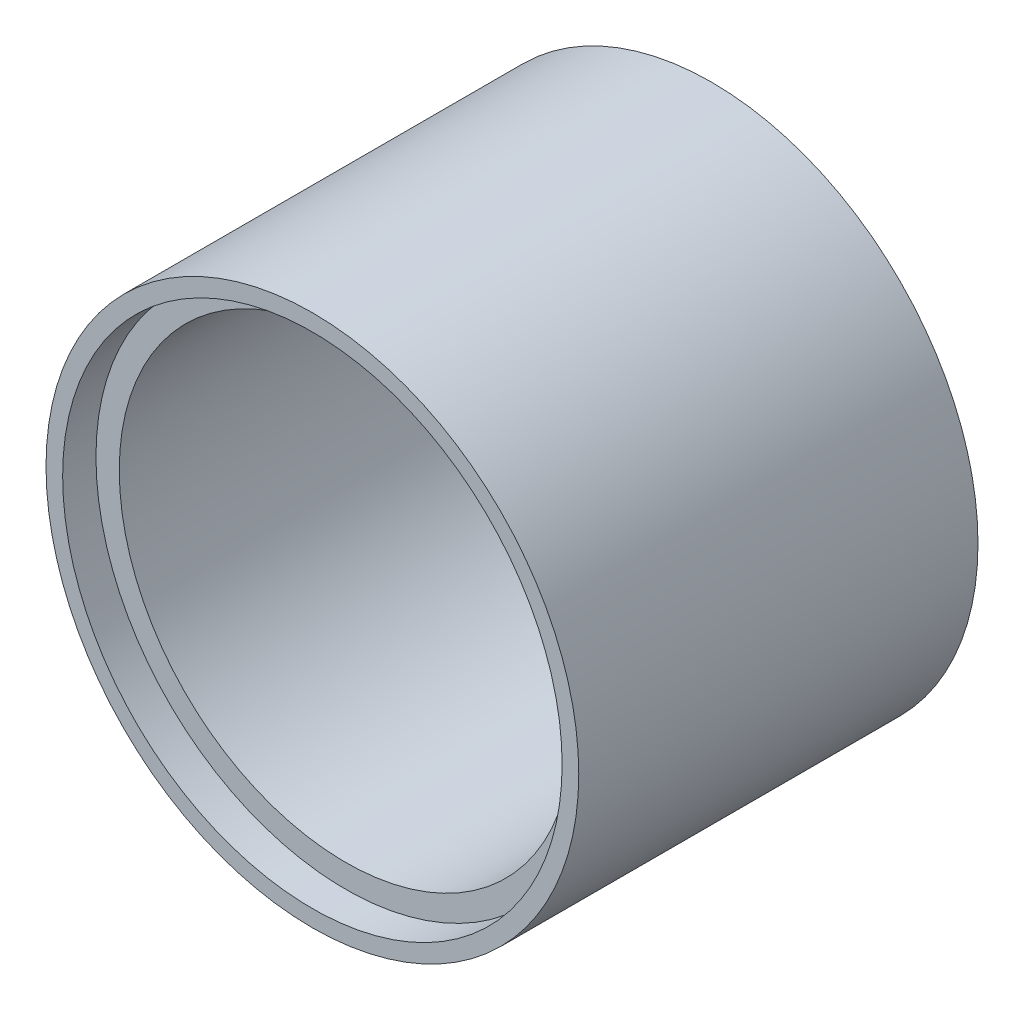
ISO-10303-21;
HEADER;
FILE_DESCRIPTION(('STEP AP214'),'2;1');
FILE_NAME('part.step','',(''),(''),'','','');
FILE_SCHEMA(('AUTOMOTIVE_DESIGN { 1 0 10303 214 1 1 1 1 }'));
ENDSEC;
DATA;
#1=APPLICATION_CONTEXT('core data for automotive mechanical design processes');
#2=APPLICATION_PROTOCOL_DEFINITION('international standard','automotive_design',2000,#1);
#3=PRODUCT_CONTEXT('',#1,'mechanical');
#4=PRODUCT('Part','Part','',(#3));
#5=PRODUCT_RELATED_PRODUCT_CATEGORY('part','',(#4));
#6=PRODUCT_DEFINITION_FORMATION('','',#4);
#7=PRODUCT_DEFINITION_CONTEXT('part definition',#1,'design');
#8=PRODUCT_DEFINITION('design','',#6,#7);
#9=PRODUCT_DEFINITION_SHAPE('','',#8);
#10=(LENGTH_UNIT() NAMED_UNIT(*) SI_UNIT(.MILLI.,.METRE.));
#11=(NAMED_UNIT(*) PLANE_ANGLE_UNIT() SI_UNIT($,.RADIAN.));
#12=(NAMED_UNIT(*) SI_UNIT($,.STERADIAN.) SOLID_ANGLE_UNIT());
#13=UNCERTAINTY_MEASURE_WITH_UNIT(LENGTH_MEASURE(1.E-05),#10,'distance_accuracy_value','');
#14=(GEOMETRIC_REPRESENTATION_CONTEXT(3) GLOBAL_UNCERTAINTY_ASSIGNED_CONTEXT((#13)) GLOBAL_UNIT_ASSIGNED_CONTEXT((#10,
#11,#12)) REPRESENTATION_CONTEXT('',''));
#15=CARTESIAN_POINT('',(0.,0.,0.));
#16=DIRECTION('',(0.,0.,1.));
#17=DIRECTION('',(1.,0.,0.));
#18=AXIS2_PLACEMENT_3D('',#15,#16,#17);
#19=CARTESIAN_POINT('',(-34.,0.,24.9746754944377));
#20=DIRECTION('',(0.,0.,1.));
#21=DIRECTION('',(1.,0.,0.));
#22=AXIS2_PLACEMENT_3D('',#19,#20,#21);
#23=PLANE('',#22);
#24=CARTESIAN_POINT('',(0.,0.,24.9746754944377));
#25=DIRECTION('',(0.,0.,-1.));
#26=DIRECTION('',(-1.,0.,0.));
#27=AXIS2_PLACEMENT_3D('',#24,#25,#26);
#28=CIRCLE('',#27,34.);
#29=CARTESIAN_POINT('',(-34.,0.,24.9746754944377));
#30=VERTEX_POINT('',#29);
#31=EDGE_CURVE('E10',#30,#30,#28,.T.);
#32=ORIENTED_EDGE('',*,*,#31,.T.);
#33=EDGE_LOOP('',(#32));
#34=FACE_BOUND('',#33,.T.);
#35=CARTESIAN_POINT('',(0.,0.,24.9746754944377));
#36=DIRECTION('',(0.,0.,-1.));
#37=DIRECTION('',(-1.,0.,0.));
#38=AXIS2_PLACEMENT_3D('',#35,#36,#37);
#39=CIRCLE('',#38,37.5);
#40=CARTESIAN_POINT('',(-37.5,0.,24.9746754944377));
#41=VERTEX_POINT('',#40);
#42=EDGE_CURVE('E59',#41,#41,#39,.T.);
#43=ORIENTED_EDGE('',*,*,#42,.F.);
#44=EDGE_LOOP('',(#43));
#45=FACE_BOUND('',#44,.T.);
#46=ADVANCED_FACE('F31',(#34,#45),#23,.T.);
#47=CARTESIAN_POINT('',(0.,0.,-51.3759717462487));
#48=DIRECTION('',(0.,0.,-1.));
#49=DIRECTION('',(-1.,0.,0.));
#50=AXIS2_PLACEMENT_3D('',#47,#48,#49);
#51=CYLINDRICAL_SURFACE('',#50,34.);
#52=CARTESIAN_POINT('',(0.,0.,-24.9746754944377));
#53=DIRECTION('',(0.,0.,-1.));
#54=DIRECTION('',(-1.,0.,0.));
#55=AXIS2_PLACEMENT_3D('',#52,#53,#54);
#56=CIRCLE('',#55,34.);
#57=CARTESIAN_POINT('',(-34.,0.,-24.9746754944377));
#58=VERTEX_POINT('',#57);
#59=EDGE_CURVE('E37',#58,#58,#56,.T.);
#60=ORIENTED_EDGE('',*,*,#59,.T.);
#61=EDGE_LOOP('',(#60));
#62=FACE_BOUND('',#61,.T.);
#63=ORIENTED_EDGE('',*,*,#31,.F.);
#64=EDGE_LOOP('',(#63));
#65=FACE_BOUND('',#64,.T.);
#66=ADVANCED_FACE('F67',(#62,#65),#51,.F.);
#67=CARTESIAN_POINT('',(-34.,0.,-24.9746754944377));
#68=DIRECTION('',(0.,0.,-1.));
#69=DIRECTION('',(-1.,0.,0.));
#70=AXIS2_PLACEMENT_3D('',#67,#68,#69);
#71=PLANE('',#70);
#72=CARTESIAN_POINT('',(0.,0.,-24.9746754944377));
#73=DIRECTION('',(0.,0.,-1.));
#74=DIRECTION('',(-1.,0.,0.));
#75=AXIS2_PLACEMENT_3D('',#72,#73,#74);
#76=CIRCLE('',#75,37.5);
#77=CARTESIAN_POINT('',(-37.5,0.,-24.9746754944377));
#78=VERTEX_POINT('',#77);
#79=EDGE_CURVE('E41',#78,#78,#76,.T.);
#80=ORIENTED_EDGE('',*,*,#79,.T.);
#81=EDGE_LOOP('',(#80));
#82=FACE_BOUND('',#81,.T.);
#83=ORIENTED_EDGE('',*,*,#59,.F.);
#84=EDGE_LOOP('',(#83));
#85=FACE_BOUND('',#84,.T.);
#86=ADVANCED_FACE('F71',(#82,#85),#71,.T.);
#87=CARTESIAN_POINT('',(0.,0.,-51.3759717462487));
#88=DIRECTION('',(0.,0.,-1.));
#89=DIRECTION('',(-1.,0.,0.));
#90=AXIS2_PLACEMENT_3D('',#87,#88,#89);
#91=CYLINDRICAL_SURFACE('',#90,37.5);
#92=CARTESIAN_POINT('',(0.,0.,-29.9746754944377));
#93=DIRECTION('',(0.,0.,-1.));
#94=DIRECTION('',(-1.,0.,0.));
#95=AXIS2_PLACEMENT_3D('',#92,#93,#94);
#96=CIRCLE('',#95,37.5);
#97=CARTESIAN_POINT('',(-37.5,0.,-29.9746754944377));
#98=VERTEX_POINT('',#97);
#99=EDGE_CURVE('E45',#98,#98,#96,.T.);
#100=ORIENTED_EDGE('',*,*,#99,.T.);
#101=EDGE_LOOP('',(#100));
#102=FACE_BOUND('',#101,.T.);
#103=ORIENTED_EDGE('',*,*,#79,.F.);
#104=EDGE_LOOP('',(#103));
#105=FACE_BOUND('',#104,.T.);
#106=ADVANCED_FACE('F75',(#102,#105),#91,.F.);
#107=CARTESIAN_POINT('',(-37.5,0.,-29.9746754944377));
#108=DIRECTION('',(0.,0.,-1.));
#109=DIRECTION('',(-1.,0.,0.));
#110=AXIS2_PLACEMENT_3D('',#107,#108,#109);
#111=PLANE('',#110);
#112=CARTESIAN_POINT('',(0.,0.,-29.9746754944377));
#113=DIRECTION('',(0.,0.,-1.));
#114=DIRECTION('',(-1.,0.,0.));
#115=AXIS2_PLACEMENT_3D('',#112,#113,#114);
#116=CIRCLE('',#115,40.);
#117=CARTESIAN_POINT('',(-40.,0.,-29.9746754944377));
#118=VERTEX_POINT('',#117);
#119=EDGE_CURVE('E50',#118,#118,#116,.T.);
#120=ORIENTED_EDGE('',*,*,#119,.T.);
#121=EDGE_LOOP('',(#120));
#122=FACE_BOUND('',#121,.T.);
#123=ORIENTED_EDGE('',*,*,#99,.F.);
#124=EDGE_LOOP('',(#123));
#125=FACE_BOUND('',#124,.T.);
#126=ADVANCED_FACE('F82',(#122,#125),#111,.T.);
#127=CARTESIAN_POINT('',(0.,0.,-51.3759717462487));
#128=DIRECTION('',(0.,0.,-1.));
#129=DIRECTION('',(-1.,0.,0.));
#130=AXIS2_PLACEMENT_3D('',#127,#128,#129);
#131=CYLINDRICAL_SURFACE('',#130,40.);
#132=CARTESIAN_POINT('',(0.,0.,29.9746754944377));
#133=DIRECTION('',(0.,0.,-1.));
#134=DIRECTION('',(-1.,0.,0.));
#135=AXIS2_PLACEMENT_3D('',#132,#133,#134);
#136=CIRCLE('',#135,40.);
#137=CARTESIAN_POINT('',(-40.,0.,29.9746754944377));
#138=VERTEX_POINT('',#137);
#139=EDGE_CURVE('E53',#138,#138,#136,.T.);
#140=ORIENTED_EDGE('',*,*,#139,.T.);
#141=EDGE_LOOP('',(#140));
#142=FACE_BOUND('',#141,.T.);
#143=ORIENTED_EDGE('',*,*,#119,.F.);
#144=EDGE_LOOP('',(#143));
#145=FACE_BOUND('',#144,.T.);
#146=ADVANCED_FACE('F86',(#142,#145),#131,.T.);
#147=CARTESIAN_POINT('',(-37.5,0.,29.9746754944377));
#148=DIRECTION('',(0.,0.,1.));
#149=DIRECTION('',(1.,0.,0.));
#150=AXIS2_PLACEMENT_3D('',#147,#148,#149);
#151=PLANE('',#150);
#152=CARTESIAN_POINT('',(0.,0.,29.9746754944377));
#153=DIRECTION('',(0.,0.,-1.));
#154=DIRECTION('',(-1.,0.,0.));
#155=AXIS2_PLACEMENT_3D('',#152,#153,#154);
#156=CIRCLE('',#155,37.5);
#157=CARTESIAN_POINT('',(-37.5,0.,29.9746754944377));
#158=VERTEX_POINT('',#157);
#159=EDGE_CURVE('E56',#158,#158,#156,.T.);
#160=ORIENTED_EDGE('',*,*,#159,.T.);
#161=EDGE_LOOP('',(#160));
#162=FACE_BOUND('',#161,.T.);
#163=ORIENTED_EDGE('',*,*,#139,.F.);
#164=EDGE_LOOP('',(#163));
#165=FACE_BOUND('',#164,.T.);
#166=ADVANCED_FACE('F90',(#162,#165),#151,.T.);
#167=CARTESIAN_POINT('',(0.,0.,-51.3759717462487));
#168=DIRECTION('',(0.,0.,-1.));
#169=DIRECTION('',(-1.,0.,0.));
#170=AXIS2_PLACEMENT_3D('',#167,#168,#169);
#171=CYLINDRICAL_SURFACE('',#170,37.5);
#172=ORIENTED_EDGE('',*,*,#42,.T.);
#173=EDGE_LOOP('',(#172));
#174=FACE_BOUND('',#173,.T.);
#175=ORIENTED_EDGE('',*,*,#159,.F.);
#176=EDGE_LOOP('',(#175));
#177=FACE_BOUND('',#176,.T.);
#178=ADVANCED_FACE('F63',(#174,#177),#171,.F.);
#179=CLOSED_SHELL('',(#46,#66,#86,#106,#126,#146,#166,#178));
#180=MANIFOLD_SOLID_BREP('B2',#179);
#181=ADVANCED_BREP_SHAPE_REPRESENTATION('',(#18,#180),#14);
#182=SHAPE_DEFINITION_REPRESENTATION(#9,#181);
ENDSEC;
END-ISO-10303-21;
